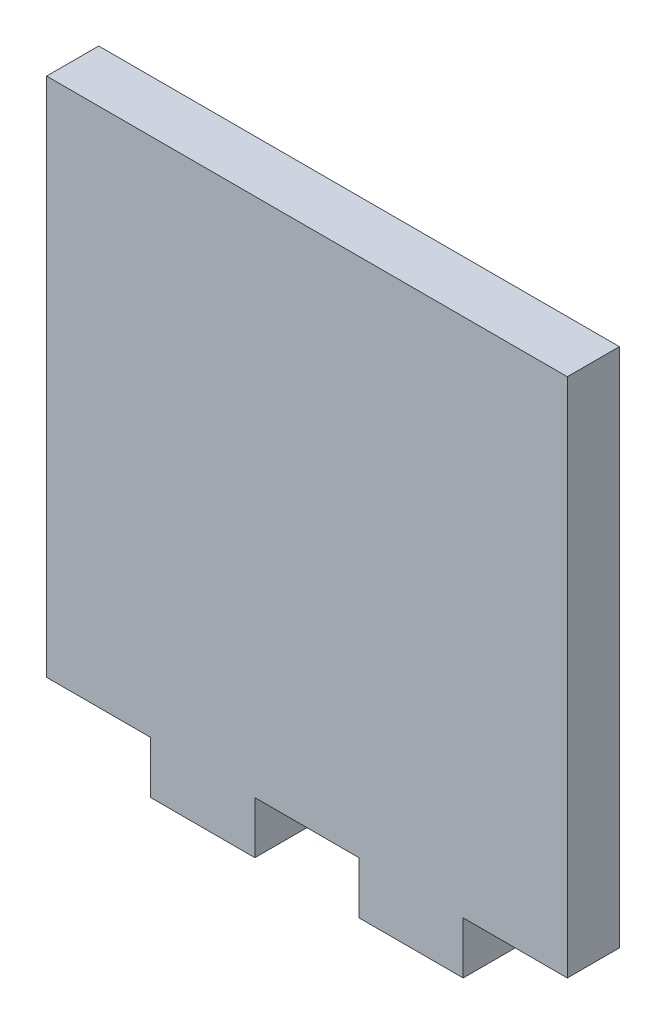
ISO-10303-21;
HEADER;
FILE_DESCRIPTION(('STEP AP214'),'2;1');
FILE_NAME('part.step','',(''),(''),'','','');
FILE_SCHEMA(('AUTOMOTIVE_DESIGN { 1 0 10303 214 1 1 1 1 }'));
ENDSEC;
DATA;
#1=APPLICATION_CONTEXT('core data for automotive mechanical design processes');
#2=APPLICATION_PROTOCOL_DEFINITION('international standard','automotive_design',2000,#1);
#3=PRODUCT_CONTEXT('',#1,'mechanical');
#4=PRODUCT('Part','Part','',(#3));
#5=PRODUCT_RELATED_PRODUCT_CATEGORY('part','',(#4));
#6=PRODUCT_DEFINITION_FORMATION('','',#4);
#7=PRODUCT_DEFINITION_CONTEXT('part definition',#1,'design');
#8=PRODUCT_DEFINITION('design','',#6,#7);
#9=PRODUCT_DEFINITION_SHAPE('','',#8);
#10=(LENGTH_UNIT() NAMED_UNIT(*) SI_UNIT(.MILLI.,.METRE.));
#11=(NAMED_UNIT(*) PLANE_ANGLE_UNIT() SI_UNIT($,.RADIAN.));
#12=(NAMED_UNIT(*) SI_UNIT($,.STERADIAN.) SOLID_ANGLE_UNIT());
#13=UNCERTAINTY_MEASURE_WITH_UNIT(LENGTH_MEASURE(1.E-05),#10,'distance_accuracy_value','');
#14=(GEOMETRIC_REPRESENTATION_CONTEXT(3) GLOBAL_UNCERTAINTY_ASSIGNED_CONTEXT((#13)) GLOBAL_UNIT_ASSIGNED_CONTEXT((#10,
#11,#12)) REPRESENTATION_CONTEXT('',''));
#15=CARTESIAN_POINT('',(0.,0.,0.));
#16=DIRECTION('',(0.,0.,1.));
#17=DIRECTION('',(1.,0.,0.));
#18=AXIS2_PLACEMENT_3D('',#15,#16,#17);
#19=CARTESIAN_POINT('',(-7.57444963045909,50.,5.));
#20=DIRECTION('',(1.,0.,0.));
#21=DIRECTION('',(0.,1.,0.));
#22=AXIS2_PLACEMENT_3D('',#19,#20,#21);
#23=PLANE('',#22);
#24=DIRECTION('',(0.,-1.,0.));
#25=VECTOR('',#24,1.);
#26=CARTESIAN_POINT('',(-7.57444963045909,50.,0.));
#27=LINE('',#26,#25);
#28=CARTESIAN_POINT('',(-7.57444963045909,50.,0.));
#29=VERTEX_POINT('',#28);
#30=CARTESIAN_POINT('',(-7.57444963045908,0.,0.));
#31=VERTEX_POINT('',#30);
#32=EDGE_CURVE('E153',#29,#31,#27,.T.);
#33=ORIENTED_EDGE('',*,*,#32,.T.);
#34=DIRECTION('',(0.,0.,-1.));
#35=VECTOR('',#34,1.);
#36=CARTESIAN_POINT('',(-7.57444963045908,0.,5.));
#37=LINE('',#36,#35);
#38=CARTESIAN_POINT('',(-7.57444963045908,0.,5.));
#39=VERTEX_POINT('',#38);
#40=EDGE_CURVE('E11',#39,#31,#37,.T.);
#41=ORIENTED_EDGE('',*,*,#40,.F.);
#42=DIRECTION('',(0.,-1.,0.));
#43=VECTOR('',#42,1.);
#44=CARTESIAN_POINT('',(-7.57444963045909,50.,5.));
#45=LINE('',#44,#43);
#46=CARTESIAN_POINT('',(-7.57444963045909,50.,5.));
#47=VERTEX_POINT('',#46);
#48=EDGE_CURVE('E175',#47,#39,#45,.T.);
#49=ORIENTED_EDGE('',*,*,#48,.F.);
#50=DIRECTION('',(0.,0.,-1.));
#51=VECTOR('',#50,1.);
#52=CARTESIAN_POINT('',(-7.57444963045909,50.,5.));
#53=LINE('',#52,#51);
#54=EDGE_CURVE('E149',#47,#29,#53,.T.);
#55=ORIENTED_EDGE('',*,*,#54,.T.);
#56=EDGE_LOOP('',(#33,#41,#49,#55));
#57=FACE_BOUND('',#56,.T.);
#58=ADVANCED_FACE('F33',(#57),#23,.F.);
#59=CARTESIAN_POINT('',(-7.57444963045908,0.,5.));
#60=DIRECTION('',(0.,1.,0.));
#61=DIRECTION('',(0.,0.,1.));
#62=AXIS2_PLACEMENT_3D('',#59,#60,#61);
#63=PLANE('',#62);
#64=DIRECTION('',(1.,0.,0.));
#65=VECTOR('',#64,1.);
#66=CARTESIAN_POINT('',(-7.57444963045908,0.,0.));
#67=LINE('',#66,#65);
#68=CARTESIAN_POINT('',(2.42555036954092,0.,0.));
#69=VERTEX_POINT('',#68);
#70=EDGE_CURVE('E156',#31,#69,#67,.T.);
#71=ORIENTED_EDGE('',*,*,#70,.T.);
#72=DIRECTION('',(0.,0.,-1.));
#73=VECTOR('',#72,1.);
#74=CARTESIAN_POINT('',(2.42555036954092,0.,5.));
#75=LINE('',#74,#73);
#76=CARTESIAN_POINT('',(2.42555036954092,0.,5.));
#77=VERTEX_POINT('',#76);
#78=EDGE_CURVE('E41',#77,#69,#75,.T.);
#79=ORIENTED_EDGE('',*,*,#78,.F.);
#80=DIRECTION('',(1.,0.,0.));
#81=VECTOR('',#80,1.);
#82=CARTESIAN_POINT('',(-7.57444963045908,0.,5.));
#83=LINE('',#82,#81);
#84=EDGE_CURVE('E104',#39,#77,#83,.T.);
#85=ORIENTED_EDGE('',*,*,#84,.F.);
#86=ORIENTED_EDGE('',*,*,#40,.T.);
#87=EDGE_LOOP('',(#71,#79,#85,#86));
#88=FACE_BOUND('',#87,.T.);
#89=ADVANCED_FACE('F253',(#88),#63,.F.);
#90=CARTESIAN_POINT('',(2.42555036954092,0.,5.));
#91=DIRECTION('',(1.,0.,0.));
#92=DIRECTION('',(0.,1.,0.));
#93=AXIS2_PLACEMENT_3D('',#90,#91,#92);
#94=PLANE('',#93);
#95=DIRECTION('',(0.,-1.,0.));
#96=VECTOR('',#95,1.);
#97=CARTESIAN_POINT('',(2.42555036954092,0.,0.));
#98=LINE('',#97,#96);
#99=CARTESIAN_POINT('',(2.42555036954091,-5.,0.));
#100=VERTEX_POINT('',#99);
#101=EDGE_CURVE('E158',#69,#100,#98,.T.);
#102=ORIENTED_EDGE('',*,*,#101,.T.);
#103=DIRECTION('',(0.,0.,-1.));
#104=VECTOR('',#103,1.);
#105=CARTESIAN_POINT('',(2.42555036954091,-5.,5.));
#106=LINE('',#105,#104);
#107=CARTESIAN_POINT('',(2.42555036954091,-5.,5.));
#108=VERTEX_POINT('',#107);
#109=EDGE_CURVE('E194',#108,#100,#106,.T.);
#110=ORIENTED_EDGE('',*,*,#109,.F.);
#111=DIRECTION('',(0.,-1.,0.));
#112=VECTOR('',#111,1.);
#113=CARTESIAN_POINT('',(2.42555036954092,0.,5.));
#114=LINE('',#113,#112);
#115=EDGE_CURVE('E202',#77,#108,#114,.T.);
#116=ORIENTED_EDGE('',*,*,#115,.F.);
#117=ORIENTED_EDGE('',*,*,#78,.T.);
#118=EDGE_LOOP('',(#102,#110,#116,#117));
#119=FACE_BOUND('',#118,.T.);
#120=ADVANCED_FACE('F200',(#119),#94,.F.);
#121=CARTESIAN_POINT('',(2.42555036954091,-5.,5.));
#122=DIRECTION('',(0.,1.,0.));
#123=DIRECTION('',(0.,0.,1.));
#124=AXIS2_PLACEMENT_3D('',#121,#122,#123);
#125=PLANE('',#124);
#126=DIRECTION('',(1.,0.,0.));
#127=VECTOR('',#126,1.);
#128=CARTESIAN_POINT('',(2.42555036954091,-5.,0.));
#129=LINE('',#128,#127);
#130=CARTESIAN_POINT('',(12.4255503695409,-5.,0.));
#131=VERTEX_POINT('',#130);
#132=EDGE_CURVE('E160',#100,#131,#129,.T.);
#133=ORIENTED_EDGE('',*,*,#132,.T.);
#134=DIRECTION('',(0.,0.,-1.));
#135=VECTOR('',#134,1.);
#136=CARTESIAN_POINT('',(12.4255503695409,-5.,5.));
#137=LINE('',#136,#135);
#138=CARTESIAN_POINT('',(12.4255503695409,-5.,5.));
#139=VERTEX_POINT('',#138);
#140=EDGE_CURVE('E191',#139,#131,#137,.T.);
#141=ORIENTED_EDGE('',*,*,#140,.F.);
#142=DIRECTION('',(1.,0.,0.));
#143=VECTOR('',#142,1.);
#144=CARTESIAN_POINT('',(2.42555036954091,-5.,5.));
#145=LINE('',#144,#143);
#146=EDGE_CURVE('E220',#108,#139,#145,.T.);
#147=ORIENTED_EDGE('',*,*,#146,.F.);
#148=ORIENTED_EDGE('',*,*,#109,.T.);
#149=EDGE_LOOP('',(#133,#141,#147,#148));
#150=FACE_BOUND('',#149,.T.);
#151=ADVANCED_FACE('F211',(#150),#125,.F.);
#152=CARTESIAN_POINT('',(12.4255503695409,-5.,5.));
#153=DIRECTION('',(-1.,0.,0.));
#154=DIRECTION('',(0.,-1.,0.));
#155=AXIS2_PLACEMENT_3D('',#152,#153,#154);
#156=PLANE('',#155);
#157=DIRECTION('',(0.,1.,0.));
#158=VECTOR('',#157,1.);
#159=CARTESIAN_POINT('',(12.4255503695409,-5.,0.));
#160=LINE('',#159,#158);
#161=CARTESIAN_POINT('',(12.4255503695409,0.,0.));
#162=VERTEX_POINT('',#161);
#163=EDGE_CURVE('E162',#131,#162,#160,.T.);
#164=ORIENTED_EDGE('',*,*,#163,.T.);
#165=DIRECTION('',(0.,0.,-1.));
#166=VECTOR('',#165,1.);
#167=CARTESIAN_POINT('',(12.4255503695409,0.,5.));
#168=LINE('',#167,#166);
#169=CARTESIAN_POINT('',(12.4255503695409,0.,5.));
#170=VERTEX_POINT('',#169);
#171=EDGE_CURVE('E188',#170,#162,#168,.T.);
#172=ORIENTED_EDGE('',*,*,#171,.F.);
#173=DIRECTION('',(0.,1.,0.));
#174=VECTOR('',#173,1.);
#175=CARTESIAN_POINT('',(12.4255503695409,-5.,5.));
#176=LINE('',#175,#174);
#177=EDGE_CURVE('E217',#139,#170,#176,.T.);
#178=ORIENTED_EDGE('',*,*,#177,.F.);
#179=ORIENTED_EDGE('',*,*,#140,.T.);
#180=EDGE_LOOP('',(#164,#172,#178,#179));
#181=FACE_BOUND('',#180,.T.);
#182=ADVANCED_FACE('F215',(#181),#156,.F.);
#183=CARTESIAN_POINT('',(12.4255503695409,0.,5.));
#184=DIRECTION('',(0.,1.,0.));
#185=DIRECTION('',(-1.,0.,0.));
#186=AXIS2_PLACEMENT_3D('',#183,#184,#185);
#187=PLANE('',#186);
#188=DIRECTION('',(1.,0.,0.));
#189=VECTOR('',#188,1.);
#190=CARTESIAN_POINT('',(12.4255503695409,0.,0.));
#191=LINE('',#190,#189);
#192=CARTESIAN_POINT('',(22.4255503695409,0.,0.));
#193=VERTEX_POINT('',#192);
#194=EDGE_CURVE('E164',#162,#193,#191,.T.);
#195=ORIENTED_EDGE('',*,*,#194,.T.);
#196=DIRECTION('',(0.,0.,-1.));
#197=VECTOR('',#196,1.);
#198=CARTESIAN_POINT('',(22.4255503695409,0.,5.));
#199=LINE('',#198,#197);
#200=CARTESIAN_POINT('',(22.4255503695409,0.,5.));
#201=VERTEX_POINT('',#200);
#202=EDGE_CURVE('E185',#201,#193,#199,.T.);
#203=ORIENTED_EDGE('',*,*,#202,.F.);
#204=DIRECTION('',(1.,0.,0.));
#205=VECTOR('',#204,1.);
#206=CARTESIAN_POINT('',(12.4255503695409,0.,5.));
#207=LINE('',#206,#205);
#208=EDGE_CURVE('E219',#170,#201,#207,.T.);
#209=ORIENTED_EDGE('',*,*,#208,.F.);
#210=ORIENTED_EDGE('',*,*,#171,.T.);
#211=EDGE_LOOP('',(#195,#203,#209,#210));
#212=FACE_BOUND('',#211,.T.);
#213=ADVANCED_FACE('F266',(#212),#187,.F.);
#214=CARTESIAN_POINT('',(22.4255503695409,0.,5.));
#215=DIRECTION('',(1.,0.,0.));
#216=DIRECTION('',(0.,1.,0.));
#217=AXIS2_PLACEMENT_3D('',#214,#215,#216);
#218=PLANE('',#217);
#219=DIRECTION('',(0.,-1.,0.));
#220=VECTOR('',#219,1.);
#221=CARTESIAN_POINT('',(22.4255503695409,0.,0.));
#222=LINE('',#221,#220);
#223=CARTESIAN_POINT('',(22.4255503695409,-5.,0.));
#224=VERTEX_POINT('',#223);
#225=EDGE_CURVE('E166',#193,#224,#222,.T.);
#226=ORIENTED_EDGE('',*,*,#225,.T.);
#227=DIRECTION('',(0.,0.,-1.));
#228=VECTOR('',#227,1.);
#229=CARTESIAN_POINT('',(22.4255503695409,-5.,5.));
#230=LINE('',#229,#228);
#231=CARTESIAN_POINT('',(22.4255503695409,-5.,5.));
#232=VERTEX_POINT('',#231);
#233=EDGE_CURVE('E182',#232,#224,#230,.T.);
#234=ORIENTED_EDGE('',*,*,#233,.F.);
#235=DIRECTION('',(0.,-1.,0.));
#236=VECTOR('',#235,1.);
#237=CARTESIAN_POINT('',(22.4255503695409,0.,5.));
#238=LINE('',#237,#236);
#239=EDGE_CURVE('E222',#201,#232,#238,.T.);
#240=ORIENTED_EDGE('',*,*,#239,.F.);
#241=ORIENTED_EDGE('',*,*,#202,.T.);
#242=EDGE_LOOP('',(#226,#234,#240,#241));
#243=FACE_BOUND('',#242,.T.);
#244=ADVANCED_FACE('F269',(#243),#218,.F.);
#245=CARTESIAN_POINT('',(22.4255503695409,-5.,5.));
#246=DIRECTION('',(0.,1.,0.));
#247=DIRECTION('',(0.,0.,1.));
#248=AXIS2_PLACEMENT_3D('',#245,#246,#247);
#249=PLANE('',#248);
#250=DIRECTION('',(1.,0.,0.));
#251=VECTOR('',#250,1.);
#252=CARTESIAN_POINT('',(22.4255503695409,-5.,0.));
#253=LINE('',#252,#251);
#254=CARTESIAN_POINT('',(32.4255503695409,-5.,0.));
#255=VERTEX_POINT('',#254);
#256=EDGE_CURVE('E168',#224,#255,#253,.T.);
#257=ORIENTED_EDGE('',*,*,#256,.T.);
#258=DIRECTION('',(0.,0.,-1.));
#259=VECTOR('',#258,1.);
#260=CARTESIAN_POINT('',(32.4255503695409,-5.,5.));
#261=LINE('',#260,#259);
#262=CARTESIAN_POINT('',(32.4255503695409,-5.,5.));
#263=VERTEX_POINT('',#262);
#264=EDGE_CURVE('E179',#263,#255,#261,.T.);
#265=ORIENTED_EDGE('',*,*,#264,.F.);
#266=DIRECTION('',(1.,0.,0.));
#267=VECTOR('',#266,1.);
#268=CARTESIAN_POINT('',(22.4255503695409,-5.,5.));
#269=LINE('',#268,#267);
#270=EDGE_CURVE('E228',#232,#263,#269,.T.);
#271=ORIENTED_EDGE('',*,*,#270,.F.);
#272=ORIENTED_EDGE('',*,*,#233,.T.);
#273=EDGE_LOOP('',(#257,#265,#271,#272));
#274=FACE_BOUND('',#273,.T.);
#275=ADVANCED_FACE('F234',(#274),#249,.F.);
#276=CARTESIAN_POINT('',(32.4255503695409,-5.,5.));
#277=DIRECTION('',(-1.,0.,0.));
#278=DIRECTION('',(0.,0.,1.));
#279=AXIS2_PLACEMENT_3D('',#276,#277,#278);
#280=PLANE('',#279);
#281=DIRECTION('',(0.,1.,0.));
#282=VECTOR('',#281,1.);
#283=CARTESIAN_POINT('',(32.4255503695409,-5.,0.));
#284=LINE('',#283,#282);
#285=CARTESIAN_POINT('',(32.4255503695409,0.,0.));
#286=VERTEX_POINT('',#285);
#287=EDGE_CURVE('E170',#255,#286,#284,.T.);
#288=ORIENTED_EDGE('',*,*,#287,.T.);
#289=DIRECTION('',(0.,0.,-1.));
#290=VECTOR('',#289,1.);
#291=CARTESIAN_POINT('',(32.4255503695409,0.,5.));
#292=LINE('',#291,#290);
#293=CARTESIAN_POINT('',(32.4255503695409,0.,5.));
#294=VERTEX_POINT('',#293);
#295=EDGE_CURVE('E144',#294,#286,#292,.T.);
#296=ORIENTED_EDGE('',*,*,#295,.F.);
#297=DIRECTION('',(0.,1.,0.));
#298=VECTOR('',#297,1.);
#299=CARTESIAN_POINT('',(32.4255503695409,-5.,5.));
#300=LINE('',#299,#298);
#301=EDGE_CURVE('E135',#263,#294,#300,.T.);
#302=ORIENTED_EDGE('',*,*,#301,.F.);
#303=ORIENTED_EDGE('',*,*,#264,.T.);
#304=EDGE_LOOP('',(#288,#296,#302,#303));
#305=FACE_BOUND('',#304,.T.);
#306=ADVANCED_FACE('F238',(#305),#280,.F.);
#307=CARTESIAN_POINT('',(32.4255503695409,0.,5.));
#308=DIRECTION('',(0.,1.,0.));
#309=DIRECTION('',(-1.,0.,0.));
#310=AXIS2_PLACEMENT_3D('',#307,#308,#309);
#311=PLANE('',#310);
#312=DIRECTION('',(1.,0.,0.));
#313=VECTOR('',#312,1.);
#314=CARTESIAN_POINT('',(32.4255503695409,0.,0.));
#315=LINE('',#314,#313);
#316=CARTESIAN_POINT('',(42.4255503695409,0.,0.));
#317=VERTEX_POINT('',#316);
#318=EDGE_CURVE('E143',#286,#317,#315,.T.);
#319=ORIENTED_EDGE('',*,*,#318,.T.);
#320=DIRECTION('',(0.,0.,-1.));
#321=VECTOR('',#320,1.);
#322=CARTESIAN_POINT('',(42.4255503695409,0.,5.));
#323=LINE('',#322,#321);
#324=CARTESIAN_POINT('',(42.4255503695409,0.,5.));
#325=VERTEX_POINT('',#324);
#326=EDGE_CURVE('E140',#325,#317,#323,.T.);
#327=ORIENTED_EDGE('',*,*,#326,.F.);
#328=DIRECTION('',(1.,0.,0.));
#329=VECTOR('',#328,1.);
#330=CARTESIAN_POINT('',(32.4255503695409,0.,5.));
#331=LINE('',#330,#329);
#332=EDGE_CURVE('E129',#294,#325,#331,.T.);
#333=ORIENTED_EDGE('',*,*,#332,.F.);
#334=ORIENTED_EDGE('',*,*,#295,.T.);
#335=EDGE_LOOP('',(#319,#327,#333,#334));
#336=FACE_BOUND('',#335,.T.);
#337=ADVANCED_FACE('F141',(#336),#311,.F.);
#338=CARTESIAN_POINT('',(42.4255503695409,50.,5.));
#339=DIRECTION('',(-1.,0.,0.));
#340=DIRECTION('',(0.,-1.,0.));
#341=AXIS2_PLACEMENT_3D('',#338,#339,#340);
#342=PLANE('',#341);
#343=DIRECTION('',(0.,1.,0.));
#344=VECTOR('',#343,1.);
#345=CARTESIAN_POINT('',(42.4255503695409,50.,0.));
#346=LINE('',#345,#344);
#347=CARTESIAN_POINT('',(42.4255503695409,50.,0.));
#348=VERTEX_POINT('',#347);
#349=EDGE_CURVE('E90',#317,#348,#346,.T.);
#350=ORIENTED_EDGE('',*,*,#349,.T.);
#351=DIRECTION('',(0.,0.,-1.));
#352=VECTOR('',#351,1.);
#353=CARTESIAN_POINT('',(42.4255503695409,50.,5.));
#354=LINE('',#353,#352);
#355=CARTESIAN_POINT('',(42.4255503695409,50.,5.));
#356=VERTEX_POINT('',#355);
#357=EDGE_CURVE('E145',#356,#348,#354,.T.);
#358=ORIENTED_EDGE('',*,*,#357,.F.);
#359=DIRECTION('',(0.,1.,0.));
#360=VECTOR('',#359,1.);
#361=CARTESIAN_POINT('',(42.4255503695409,50.,5.));
#362=LINE('',#361,#360);
#363=EDGE_CURVE('E133',#325,#356,#362,.T.);
#364=ORIENTED_EDGE('',*,*,#363,.F.);
#365=ORIENTED_EDGE('',*,*,#326,.T.);
#366=EDGE_LOOP('',(#350,#358,#364,#365));
#367=FACE_BOUND('',#366,.T.);
#368=ADVANCED_FACE('F147',(#367),#342,.F.);
#369=CARTESIAN_POINT('',(-7.57444963045909,50.,5.));
#370=DIRECTION('',(0.,-1.,0.));
#371=DIRECTION('',(0.,0.,-1.));
#372=AXIS2_PLACEMENT_3D('',#369,#370,#371);
#373=PLANE('',#372);
#374=DIRECTION('',(-1.,0.,0.));
#375=VECTOR('',#374,1.);
#376=CARTESIAN_POINT('',(-7.57444963045909,50.,0.));
#377=LINE('',#376,#375);
#378=EDGE_CURVE('E96',#348,#29,#377,.T.);
#379=ORIENTED_EDGE('',*,*,#378,.T.);
#380=ORIENTED_EDGE('',*,*,#54,.F.);
#381=DIRECTION('',(-1.,0.,0.));
#382=VECTOR('',#381,1.);
#383=CARTESIAN_POINT('',(-7.57444963045909,50.,5.));
#384=LINE('',#383,#382);
#385=EDGE_CURVE('E49',#356,#47,#384,.T.);
#386=ORIENTED_EDGE('',*,*,#385,.F.);
#387=ORIENTED_EDGE('',*,*,#357,.T.);
#388=EDGE_LOOP('',(#379,#380,#386,#387));
#389=FACE_BOUND('',#388,.T.);
#390=ADVANCED_FACE('F242',(#389),#373,.F.);
#391=CARTESIAN_POINT('',(0.,0.,5.));
#392=DIRECTION('',(0.,0.,1.));
#393=DIRECTION('',(1.,0.,0.));
#394=AXIS2_PLACEMENT_3D('',#391,#392,#393);
#395=PLANE('',#394);
#396=ORIENTED_EDGE('',*,*,#48,.T.);
#397=ORIENTED_EDGE('',*,*,#84,.T.);
#398=ORIENTED_EDGE('',*,*,#115,.T.);
#399=ORIENTED_EDGE('',*,*,#146,.T.);
#400=ORIENTED_EDGE('',*,*,#177,.T.);
#401=ORIENTED_EDGE('',*,*,#208,.T.);
#402=ORIENTED_EDGE('',*,*,#239,.T.);
#403=ORIENTED_EDGE('',*,*,#270,.T.);
#404=ORIENTED_EDGE('',*,*,#301,.T.);
#405=ORIENTED_EDGE('',*,*,#332,.T.);
#406=ORIENTED_EDGE('',*,*,#363,.T.);
#407=ORIENTED_EDGE('',*,*,#385,.T.);
#408=EDGE_LOOP('',(#396,#397,#398,#399,#400,#401,#402,#403,#404,#405,#406,#407));
#409=FACE_BOUND('',#408,.T.);
#410=ADVANCED_FACE('F131',(#409),#395,.T.);
#411=CARTESIAN_POINT('',(0.,0.,0.));
#412=DIRECTION('',(0.,0.,1.));
#413=DIRECTION('',(1.,0.,0.));
#414=AXIS2_PLACEMENT_3D('',#411,#412,#413);
#415=PLANE('',#414);
#416=ORIENTED_EDGE('',*,*,#32,.F.);
#417=ORIENTED_EDGE('',*,*,#378,.F.);
#418=ORIENTED_EDGE('',*,*,#349,.F.);
#419=ORIENTED_EDGE('',*,*,#318,.F.);
#420=ORIENTED_EDGE('',*,*,#287,.F.);
#421=ORIENTED_EDGE('',*,*,#256,.F.);
#422=ORIENTED_EDGE('',*,*,#225,.F.);
#423=ORIENTED_EDGE('',*,*,#194,.F.);
#424=ORIENTED_EDGE('',*,*,#163,.F.);
#425=ORIENTED_EDGE('',*,*,#132,.F.);
#426=ORIENTED_EDGE('',*,*,#101,.F.);
#427=ORIENTED_EDGE('',*,*,#70,.F.);
#428=EDGE_LOOP('',(#416,#417,#418,#419,#420,#421,#422,#423,#424,#425,#426,#427));
#429=FACE_BOUND('',#428,.T.);
#430=ADVANCED_FACE('F206',(#429),#415,.F.);
#431=CLOSED_SHELL('',(#58,#89,#120,#151,#182,#213,#244,#275,#306,#337,#368,#390,#410,#430));
#432=MANIFOLD_SOLID_BREP('B2',#431);
#433=ADVANCED_BREP_SHAPE_REPRESENTATION('',(#18,#432),#14);
#434=SHAPE_DEFINITION_REPRESENTATION(#9,#433);
ENDSEC;
END-ISO-10303-21;
